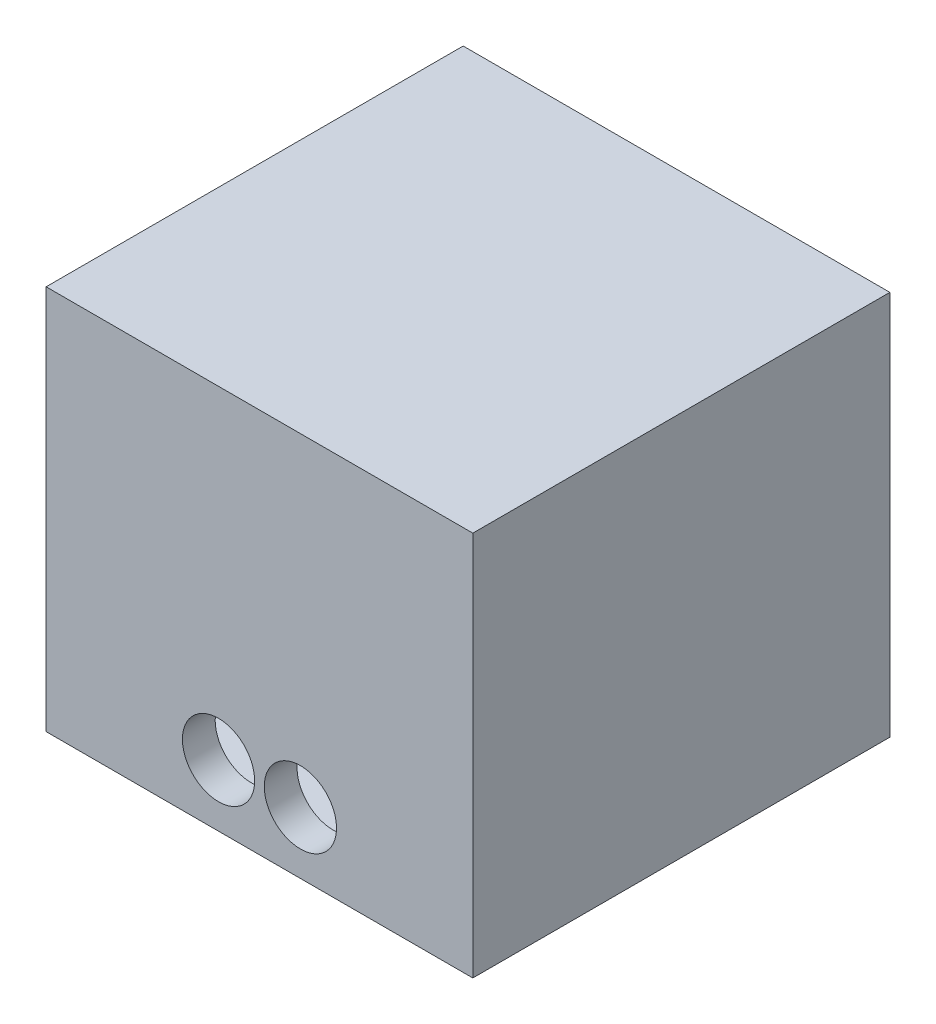
ISO-10303-21;
HEADER;
FILE_DESCRIPTION(('STEP AP214'),'2;1');
FILE_NAME('part.step','',(''),(''),'','','');
FILE_SCHEMA(('AUTOMOTIVE_DESIGN { 1 0 10303 214 1 1 1 1 }'));
ENDSEC;
DATA;
#1=APPLICATION_CONTEXT('core data for automotive mechanical design processes');
#2=APPLICATION_PROTOCOL_DEFINITION('international standard','automotive_design',2000,#1);
#3=PRODUCT_CONTEXT('',#1,'mechanical');
#4=PRODUCT('Part','Part','',(#3));
#5=PRODUCT_RELATED_PRODUCT_CATEGORY('part','',(#4));
#6=PRODUCT_DEFINITION_FORMATION('','',#4);
#7=PRODUCT_DEFINITION_CONTEXT('part definition',#1,'design');
#8=PRODUCT_DEFINITION('design','',#6,#7);
#9=PRODUCT_DEFINITION_SHAPE('','',#8);
#10=(LENGTH_UNIT() NAMED_UNIT(*) SI_UNIT(.MILLI.,.METRE.));
#11=(NAMED_UNIT(*) PLANE_ANGLE_UNIT() SI_UNIT($,.RADIAN.));
#12=(NAMED_UNIT(*) SI_UNIT($,.STERADIAN.) SOLID_ANGLE_UNIT());
#13=UNCERTAINTY_MEASURE_WITH_UNIT(LENGTH_MEASURE(1.E-05),#10,'distance_accuracy_value','');
#14=(GEOMETRIC_REPRESENTATION_CONTEXT(3) GLOBAL_UNCERTAINTY_ASSIGNED_CONTEXT((#13)) GLOBAL_UNIT_ASSIGNED_CONTEXT((#10,
#11,#12)) REPRESENTATION_CONTEXT('',''));
#15=CARTESIAN_POINT('',(0.,0.,0.));
#16=DIRECTION('',(0.,0.,1.));
#17=DIRECTION('',(1.,0.,0.));
#18=AXIS2_PLACEMENT_3D('',#15,#16,#17);
#19=CARTESIAN_POINT('',(0.,0.,433.));
#20=DIRECTION('',(0.,0.,1.));
#21=DIRECTION('',(1.,0.,0.));
#22=AXIS2_PLACEMENT_3D('',#19,#20,#21);
#23=PLANE('',#22);
#24=DIRECTION('',(-1.,0.,0.));
#25=VECTOR('',#24,1.);
#26=CARTESIAN_POINT('',(443.,782.,433.));
#27=LINE('',#26,#25);
#28=CARTESIAN_POINT('',(443.,782.,433.));
#29=VERTEX_POINT('',#28);
#30=CARTESIAN_POINT('',(-443.,782.,433.));
#31=VERTEX_POINT('',#30);
#32=EDGE_CURVE('E252',#29,#31,#27,.T.);
#33=ORIENTED_EDGE('',*,*,#32,.T.);
#34=DIRECTION('',(0.,-1.,0.));
#35=VECTOR('',#34,1.);
#36=CARTESIAN_POINT('',(-443.,782.,433.));
#37=LINE('',#36,#35);
#38=CARTESIAN_POINT('',(-443.,-18.,433.));
#39=VERTEX_POINT('',#38);
#40=EDGE_CURVE('E271',#31,#39,#37,.T.);
#41=ORIENTED_EDGE('',*,*,#40,.T.);
#42=DIRECTION('',(1.,0.,0.));
#43=VECTOR('',#42,1.);
#44=CARTESIAN_POINT('',(-443.,-18.,433.));
#45=LINE('',#44,#43);
#46=CARTESIAN_POINT('',(443.,-18.,433.));
#47=VERTEX_POINT('',#46);
#48=EDGE_CURVE('E276',#39,#47,#45,.T.);
#49=ORIENTED_EDGE('',*,*,#48,.T.);
#50=DIRECTION('',(0.,1.,0.));
#51=VECTOR('',#50,1.);
#52=CARTESIAN_POINT('',(443.,-18.,433.));
#53=LINE('',#52,#51);
#54=EDGE_CURVE('E262',#47,#29,#53,.T.);
#55=ORIENTED_EDGE('',*,*,#54,.T.);
#56=EDGE_LOOP('',(#33,#41,#49,#55));
#57=FACE_BOUND('',#56,.T.);
#58=CARTESIAN_POINT('',(-85.,110.,433.));
#59=DIRECTION('',(0.,0.,-1.));
#60=DIRECTION('',(-1.,0.,0.));
#61=AXIS2_PLACEMENT_3D('',#58,#59,#60);
#62=CIRCLE('',#61,75.);
#63=CARTESIAN_POINT('',(-160.,110.,433.));
#64=VERTEX_POINT('',#63);
#65=EDGE_CURVE('E431',#64,#64,#62,.T.);
#66=ORIENTED_EDGE('',*,*,#65,.T.);
#67=EDGE_LOOP('',(#66));
#68=FACE_BOUND('',#67,.T.);
#69=CARTESIAN_POINT('',(85.,110.,433.));
#70=DIRECTION('',(0.,0.,-1.));
#71=DIRECTION('',(-1.,0.,0.));
#72=AXIS2_PLACEMENT_3D('',#69,#70,#71);
#73=CIRCLE('',#72,75.);
#74=CARTESIAN_POINT('',(9.99999999999998,110.,433.));
#75=VERTEX_POINT('',#74);
#76=EDGE_CURVE('E423',#75,#75,#73,.T.);
#77=ORIENTED_EDGE('',*,*,#76,.T.);
#78=EDGE_LOOP('',(#77));
#79=FACE_BOUND('',#78,.T.);
#80=ADVANCED_FACE('F37',(#57,#68,#79),#23,.T.);
#81=CARTESIAN_POINT('',(425.,757.,-415.));
#82=DIRECTION('',(0.,0.,-1.));
#83=DIRECTION('',(0.,1.,0.));
#84=AXIS2_PLACEMENT_3D('',#81,#82,#83);
#85=PLANE('',#84);
#86=DIRECTION('',(1.,0.,0.));
#87=VECTOR('',#86,1.);
#88=CARTESIAN_POINT('',(425.,740.,-415.));
#89=LINE('',#88,#87);
#90=CARTESIAN_POINT('',(-285.,740.,-415.));
#91=VERTEX_POINT('',#90);
#92=CARTESIAN_POINT('',(285.,740.,-415.));
#93=VERTEX_POINT('',#92);
#94=EDGE_CURVE('E48',#91,#93,#89,.T.);
#95=ORIENTED_EDGE('',*,*,#94,.T.);
#96=CARTESIAN_POINT('',(285.,725.,-415.));
#97=DIRECTION('',(0.,0.,-1.));
#98=DIRECTION('',(0.,1.,0.));
#99=AXIS2_PLACEMENT_3D('',#96,#97,#98);
#100=CIRCLE('',#99,15.);
#101=CARTESIAN_POINT('',(300.,725.,-415.));
#102=VERTEX_POINT('',#101);
#103=EDGE_CURVE('E11',#93,#102,#100,.T.);
#104=ORIENTED_EDGE('',*,*,#103,.T.);
#105=DIRECTION('',(0.,-1.,0.));
#106=VECTOR('',#105,1.);
#107=CARTESIAN_POINT('',(300.,757.000000000001,-415.));
#108=LINE('',#107,#106);
#109=CARTESIAN_POINT('',(300.,715.,-415.));
#110=VERTEX_POINT('',#109);
#111=EDGE_CURVE('E281',#102,#110,#108,.T.);
#112=ORIENTED_EDGE('',*,*,#111,.T.);
#113=CARTESIAN_POINT('',(285.,715.,-415.));
#114=DIRECTION('',(0.,0.,-1.));
#115=DIRECTION('',(0.,1.,0.));
#116=AXIS2_PLACEMENT_3D('',#113,#114,#115);
#117=CIRCLE('',#116,14.9999999999997);
#118=CARTESIAN_POINT('',(285.,700.,-415.));
#119=VERTEX_POINT('',#118);
#120=EDGE_CURVE('E293',#110,#119,#117,.T.);
#121=ORIENTED_EDGE('',*,*,#120,.T.);
#122=DIRECTION('',(-1.,0.,0.));
#123=VECTOR('',#122,1.);
#124=CARTESIAN_POINT('',(425.,700.,-415.));
#125=LINE('',#124,#123);
#126=CARTESIAN_POINT('',(-285.,700.,-415.));
#127=VERTEX_POINT('',#126);
#128=EDGE_CURVE('E295',#119,#127,#125,.T.);
#129=ORIENTED_EDGE('',*,*,#128,.T.);
#130=CARTESIAN_POINT('',(-285.,715.,-415.));
#131=DIRECTION('',(0.,0.,-1.));
#132=DIRECTION('',(0.,1.,0.));
#133=AXIS2_PLACEMENT_3D('',#130,#131,#132);
#134=CIRCLE('',#133,14.9999999999997);
#135=CARTESIAN_POINT('',(-300.,715.,-415.));
#136=VERTEX_POINT('',#135);
#137=EDGE_CURVE('E300',#127,#136,#134,.T.);
#138=ORIENTED_EDGE('',*,*,#137,.T.);
#139=DIRECTION('',(0.,1.,0.));
#140=VECTOR('',#139,1.);
#141=CARTESIAN_POINT('',(-300.,757.,-415.));
#142=LINE('',#141,#140);
#143=CARTESIAN_POINT('',(-300.,725.,-415.));
#144=VERTEX_POINT('',#143);
#145=EDGE_CURVE('E297',#136,#144,#142,.T.);
#146=ORIENTED_EDGE('',*,*,#145,.T.);
#147=CARTESIAN_POINT('',(-285.,725.,-415.));
#148=DIRECTION('',(0.,0.,-1.));
#149=DIRECTION('',(0.,1.,0.));
#150=AXIS2_PLACEMENT_3D('',#147,#148,#149);
#151=CIRCLE('',#150,15.0000000000001);
#152=EDGE_CURVE('E303',#144,#91,#151,.T.);
#153=ORIENTED_EDGE('',*,*,#152,.T.);
#154=EDGE_LOOP('',(#95,#104,#112,#121,#129,#138,#146,#153));
#155=FACE_BOUND('',#154,.T.);
#156=DIRECTION('',(0.,-1.,0.));
#157=VECTOR('',#156,1.);
#158=CARTESIAN_POINT('',(-425.,757.,-415.));
#159=LINE('',#158,#157);
#160=CARTESIAN_POINT('',(-425.,757.,-415.));
#161=VERTEX_POINT('',#160);
#162=CARTESIAN_POINT('',(-425.,6.9999999999999,-415.));
#163=VERTEX_POINT('',#162);
#164=EDGE_CURVE('E211',#161,#163,#159,.T.);
#165=ORIENTED_EDGE('',*,*,#164,.T.);
#166=DIRECTION('',(-1.,0.,0.));
#167=VECTOR('',#166,1.);
#168=CARTESIAN_POINT('',(425.,6.9999999999999,-415.));
#169=LINE('',#168,#167);
#170=CARTESIAN_POINT('',(425.,6.9999999999999,-415.));
#171=VERTEX_POINT('',#170);
#172=EDGE_CURVE('E238',#171,#163,#169,.T.);
#173=ORIENTED_EDGE('',*,*,#172,.F.);
#174=DIRECTION('',(0.,-1.,0.));
#175=VECTOR('',#174,1.);
#176=CARTESIAN_POINT('',(425.,757.,-415.));
#177=LINE('',#176,#175);
#178=CARTESIAN_POINT('',(425.,757.,-415.));
#179=VERTEX_POINT('',#178);
#180=EDGE_CURVE('E221',#179,#171,#177,.T.);
#181=ORIENTED_EDGE('',*,*,#180,.F.);
#182=DIRECTION('',(-1.,0.,0.));
#183=VECTOR('',#182,1.);
#184=CARTESIAN_POINT('',(425.,757.,-415.));
#185=LINE('',#184,#183);
#186=EDGE_CURVE('E248',#179,#161,#185,.T.);
#187=ORIENTED_EDGE('',*,*,#186,.T.);
#188=EDGE_LOOP('',(#165,#173,#181,#187));
#189=FACE_BOUND('',#188,.T.);
#190=ADVANCED_FACE('F310',(#155,#189),#85,.F.);
#191=CARTESIAN_POINT('',(425.,757.,415.));
#192=DIRECTION('',(0.,1.,0.));
#193=DIRECTION('',(0.,0.,1.));
#194=AXIS2_PLACEMENT_3D('',#191,#192,#193);
#195=PLANE('',#194);
#196=DIRECTION('',(0.,0.,-1.));
#197=VECTOR('',#196,1.);
#198=CARTESIAN_POINT('',(-425.,757.,415.));
#199=LINE('',#198,#197);
#200=CARTESIAN_POINT('',(-425.,757.,415.));
#201=VERTEX_POINT('',#200);
#202=EDGE_CURVE('E230',#201,#161,#199,.T.);
#203=ORIENTED_EDGE('',*,*,#202,.T.);
#204=ORIENTED_EDGE('',*,*,#186,.F.);
#205=DIRECTION('',(0.,0.,-1.));
#206=VECTOR('',#205,1.);
#207=CARTESIAN_POINT('',(425.,757.,415.));
#208=LINE('',#207,#206);
#209=CARTESIAN_POINT('',(425.,757.,415.));
#210=VERTEX_POINT('',#209);
#211=EDGE_CURVE('E232',#210,#179,#208,.T.);
#212=ORIENTED_EDGE('',*,*,#211,.F.);
#213=DIRECTION('',(-1.,0.,0.));
#214=VECTOR('',#213,1.);
#215=CARTESIAN_POINT('',(425.,757.,415.));
#216=LINE('',#215,#214);
#217=EDGE_CURVE('E255',#210,#201,#216,.T.);
#218=ORIENTED_EDGE('',*,*,#217,.T.);
#219=EDGE_LOOP('',(#203,#204,#212,#218));
#220=FACE_BOUND('',#219,.T.);
#221=ADVANCED_FACE('F352',(#220),#195,.F.);
#222=CARTESIAN_POINT('',(425.,6.9999999999999,415.));
#223=DIRECTION('',(0.,0.,1.));
#224=DIRECTION('',(0.,-1.,0.));
#225=AXIS2_PLACEMENT_3D('',#222,#223,#224);
#226=PLANE('',#225);
#227=CARTESIAN_POINT('',(-85.,110.,415.));
#228=DIRECTION('',(0.,0.,-1.));
#229=DIRECTION('',(1.,0.,0.));
#230=AXIS2_PLACEMENT_3D('',#227,#228,#229);
#231=CIRCLE('',#230,90.);
#232=CARTESIAN_POINT('',(0.,80.419601084502,415.));
#233=VERTEX_POINT('',#232);
#234=CARTESIAN_POINT('',(0.,139.580398915498,415.));
#235=VERTEX_POINT('',#234);
#236=EDGE_CURVE('E181',#233,#235,#231,.T.);
#237=ORIENTED_EDGE('',*,*,#236,.F.);
#238=CARTESIAN_POINT('',(85.,110.,415.));
#239=DIRECTION('',(0.,0.,-1.));
#240=DIRECTION('',(1.,0.,0.));
#241=AXIS2_PLACEMENT_3D('',#238,#239,#240);
#242=CIRCLE('',#241,90.);
#243=EDGE_CURVE('E53',#235,#233,#242,.T.);
#244=ORIENTED_EDGE('',*,*,#243,.F.);
#245=EDGE_LOOP('',(#237,#244));
#246=FACE_BOUND('',#245,.T.);
#247=DIRECTION('',(0.,1.,0.));
#248=VECTOR('',#247,1.);
#249=CARTESIAN_POINT('',(-425.,6.9999999999999,415.));
#250=LINE('',#249,#248);
#251=CARTESIAN_POINT('',(-425.,6.9999999999999,415.));
#252=VERTEX_POINT('',#251);
#253=EDGE_CURVE('E242',#252,#201,#250,.T.);
#254=ORIENTED_EDGE('',*,*,#253,.T.);
#255=ORIENTED_EDGE('',*,*,#217,.F.);
#256=DIRECTION('',(0.,1.,0.));
#257=VECTOR('',#256,1.);
#258=CARTESIAN_POINT('',(425.,6.9999999999999,415.));
#259=LINE('',#258,#257);
#260=CARTESIAN_POINT('',(425.,6.9999999999999,415.));
#261=VERTEX_POINT('',#260);
#262=EDGE_CURVE('E235',#261,#210,#259,.T.);
#263=ORIENTED_EDGE('',*,*,#262,.F.);
#264=DIRECTION('',(-1.,0.,0.));
#265=VECTOR('',#264,1.);
#266=CARTESIAN_POINT('',(425.,6.9999999999999,415.));
#267=LINE('',#266,#265);
#268=EDGE_CURVE('E251',#261,#252,#267,.T.);
#269=ORIENTED_EDGE('',*,*,#268,.T.);
#270=EDGE_LOOP('',(#254,#255,#263,#269));
#271=FACE_BOUND('',#270,.T.);
#272=ADVANCED_FACE('F512',(#246,#271),#226,.F.);
#273=CARTESIAN_POINT('',(425.,6.9999999999999,-415.));
#274=DIRECTION('',(0.,-1.,0.));
#275=DIRECTION('',(0.,0.,-1.));
#276=AXIS2_PLACEMENT_3D('',#273,#274,#275);
#277=PLANE('',#276);
#278=DIRECTION('',(0.,0.,1.));
#279=VECTOR('',#278,1.);
#280=CARTESIAN_POINT('',(-425.,6.9999999999999,-415.));
#281=LINE('',#280,#279);
#282=EDGE_CURVE('E241',#163,#252,#281,.T.);
#283=ORIENTED_EDGE('',*,*,#282,.T.);
#284=ORIENTED_EDGE('',*,*,#268,.F.);
#285=DIRECTION('',(0.,0.,1.));
#286=VECTOR('',#285,1.);
#287=CARTESIAN_POINT('',(425.,6.9999999999999,-415.));
#288=LINE('',#287,#286);
#289=EDGE_CURVE('E226',#171,#261,#288,.T.);
#290=ORIENTED_EDGE('',*,*,#289,.F.);
#291=ORIENTED_EDGE('',*,*,#172,.T.);
#292=EDGE_LOOP('',(#283,#284,#290,#291));
#293=FACE_BOUND('',#292,.T.);
#294=ADVANCED_FACE('F511',(#293),#277,.F.);
#295=CARTESIAN_POINT('',(425.,0.,0.));
#296=DIRECTION('',(-1.,0.,0.));
#297=DIRECTION('',(0.,0.,1.));
#298=AXIS2_PLACEMENT_3D('',#295,#296,#297);
#299=PLANE('',#298);
#300=ORIENTED_EDGE('',*,*,#180,.T.);
#301=ORIENTED_EDGE('',*,*,#289,.T.);
#302=ORIENTED_EDGE('',*,*,#262,.T.);
#303=ORIENTED_EDGE('',*,*,#211,.T.);
#304=EDGE_LOOP('',(#300,#301,#302,#303));
#305=FACE_BOUND('',#304,.T.);
#306=ADVANCED_FACE('F336',(#305),#299,.T.);
#307=CARTESIAN_POINT('',(-425.,0.,0.));
#308=DIRECTION('',(-1.,0.,0.));
#309=DIRECTION('',(0.,0.,1.));
#310=AXIS2_PLACEMENT_3D('',#307,#308,#309);
#311=PLANE('',#310);
#312=ORIENTED_EDGE('',*,*,#164,.F.);
#313=ORIENTED_EDGE('',*,*,#202,.F.);
#314=ORIENTED_EDGE('',*,*,#253,.F.);
#315=ORIENTED_EDGE('',*,*,#282,.F.);
#316=EDGE_LOOP('',(#312,#313,#314,#315));
#317=FACE_BOUND('',#316,.T.);
#318=ADVANCED_FACE('F326',(#317),#311,.F.);
#319=CARTESIAN_POINT('',(285.,725.,-145.));
#320=DIRECTION('',(0.,0.,-1.));
#321=DIRECTION('',(-1.,0.,0.));
#322=AXIS2_PLACEMENT_3D('',#319,#320,#321);
#323=CYLINDRICAL_SURFACE('',#322,15.);
#324=DIRECTION('',(0.,0.,-1.));
#325=VECTOR('',#324,1.);
#326=CARTESIAN_POINT('',(285.,740.,-145.));
#327=LINE('',#326,#325);
#328=CARTESIAN_POINT('',(285.,740.,-433.));
#329=VERTEX_POINT('',#328);
#330=EDGE_CURVE('E209',#93,#329,#327,.T.);
#331=ORIENTED_EDGE('',*,*,#330,.T.);
#332=CARTESIAN_POINT('',(285.,725.,-433.));
#333=DIRECTION('',(0.,0.,-1.));
#334=DIRECTION('',(-1.,0.,0.));
#335=AXIS2_PLACEMENT_3D('',#332,#333,#334);
#336=CIRCLE('',#335,15.);
#337=CARTESIAN_POINT('',(300.,725.,-433.));
#338=VERTEX_POINT('',#337);
#339=EDGE_CURVE('E62',#329,#338,#336,.T.);
#340=ORIENTED_EDGE('',*,*,#339,.T.);
#341=DIRECTION('',(0.,0.,-1.));
#342=VECTOR('',#341,1.);
#343=CARTESIAN_POINT('',(300.,725.,-145.));
#344=LINE('',#343,#342);
#345=EDGE_CURVE('E206',#102,#338,#344,.T.);
#346=ORIENTED_EDGE('',*,*,#345,.F.);
#347=ORIENTED_EDGE('',*,*,#103,.F.);
#348=EDGE_LOOP('',(#331,#340,#346,#347));
#349=FACE_BOUND('',#348,.T.);
#350=ADVANCED_FACE('F329',(#349),#323,.F.);
#351=CARTESIAN_POINT('',(-285.,740.,-145.));
#352=DIRECTION('',(0.,1.,0.));
#353=DIRECTION('',(-1.,0.,0.));
#354=AXIS2_PLACEMENT_3D('',#351,#352,#353);
#355=PLANE('',#354);
#356=DIRECTION('',(0.,0.,-1.));
#357=VECTOR('',#356,1.);
#358=CARTESIAN_POINT('',(-285.,740.,-145.));
#359=LINE('',#358,#357);
#360=CARTESIAN_POINT('',(-285.,740.,-433.));
#361=VERTEX_POINT('',#360);
#362=EDGE_CURVE('E212',#91,#361,#359,.T.);
#363=ORIENTED_EDGE('',*,*,#362,.T.);
#364=DIRECTION('',(1.,0.,0.));
#365=VECTOR('',#364,1.);
#366=CARTESIAN_POINT('',(-285.,740.,-433.));
#367=LINE('',#366,#365);
#368=EDGE_CURVE('E204',#361,#329,#367,.T.);
#369=ORIENTED_EDGE('',*,*,#368,.T.);
#370=ORIENTED_EDGE('',*,*,#330,.F.);
#371=ORIENTED_EDGE('',*,*,#94,.F.);
#372=EDGE_LOOP('',(#363,#369,#370,#371));
#373=FACE_BOUND('',#372,.T.);
#374=ADVANCED_FACE('F315',(#373),#355,.F.);
#375=CARTESIAN_POINT('',(-285.,725.,-145.));
#376=DIRECTION('',(0.,0.,-1.));
#377=DIRECTION('',(-1.,0.,0.));
#378=AXIS2_PLACEMENT_3D('',#375,#376,#377);
#379=CYLINDRICAL_SURFACE('',#378,15.0000000000001);
#380=DIRECTION('',(0.,0.,-1.));
#381=VECTOR('',#380,1.);
#382=CARTESIAN_POINT('',(-300.,725.,-145.));
#383=LINE('',#382,#381);
#384=CARTESIAN_POINT('',(-300.,725.,-433.));
#385=VERTEX_POINT('',#384);
#386=EDGE_CURVE('E213',#144,#385,#383,.T.);
#387=ORIENTED_EDGE('',*,*,#386,.T.);
#388=CARTESIAN_POINT('',(-285.,725.,-433.));
#389=DIRECTION('',(0.,0.,-1.));
#390=DIRECTION('',(-1.,0.,0.));
#391=AXIS2_PLACEMENT_3D('',#388,#389,#390);
#392=CIRCLE('',#391,15.0000000000001);
#393=EDGE_CURVE('E205',#385,#361,#392,.T.);
#394=ORIENTED_EDGE('',*,*,#393,.T.);
#395=ORIENTED_EDGE('',*,*,#362,.F.);
#396=ORIENTED_EDGE('',*,*,#152,.F.);
#397=EDGE_LOOP('',(#387,#394,#395,#396));
#398=FACE_BOUND('',#397,.T.);
#399=ADVANCED_FACE('F313',(#398),#379,.F.);
#400=CARTESIAN_POINT('',(-300.,715.,-145.));
#401=DIRECTION('',(-1.,0.,0.));
#402=DIRECTION('',(0.,0.,1.));
#403=AXIS2_PLACEMENT_3D('',#400,#401,#402);
#404=PLANE('',#403);
#405=DIRECTION('',(0.,0.,-1.));
#406=VECTOR('',#405,1.);
#407=CARTESIAN_POINT('',(-300.,715.,-145.));
#408=LINE('',#407,#406);
#409=CARTESIAN_POINT('',(-300.,715.,-433.));
#410=VERTEX_POINT('',#409);
#411=EDGE_CURVE('E218',#136,#410,#408,.T.);
#412=ORIENTED_EDGE('',*,*,#411,.T.);
#413=DIRECTION('',(0.,1.,0.));
#414=VECTOR('',#413,1.);
#415=CARTESIAN_POINT('',(-300.,715.,-433.));
#416=LINE('',#415,#414);
#417=EDGE_CURVE('E196',#410,#385,#416,.T.);
#418=ORIENTED_EDGE('',*,*,#417,.T.);
#419=ORIENTED_EDGE('',*,*,#386,.F.);
#420=ORIENTED_EDGE('',*,*,#145,.F.);
#421=EDGE_LOOP('',(#412,#418,#419,#420));
#422=FACE_BOUND('',#421,.T.);
#423=ADVANCED_FACE('F399',(#422),#404,.F.);
#424=CARTESIAN_POINT('',(-285.,715.,-145.));
#425=DIRECTION('',(0.,0.,-1.));
#426=DIRECTION('',(-1.,0.,0.));
#427=AXIS2_PLACEMENT_3D('',#424,#425,#426);
#428=CYLINDRICAL_SURFACE('',#427,14.9999999999997);
#429=DIRECTION('',(0.,0.,-1.));
#430=VECTOR('',#429,1.);
#431=CARTESIAN_POINT('',(-285.,700.,-145.));
#432=LINE('',#431,#430);
#433=CARTESIAN_POINT('',(-285.,700.,-433.));
#434=VERTEX_POINT('',#433);
#435=EDGE_CURVE('E216',#127,#434,#432,.T.);
#436=ORIENTED_EDGE('',*,*,#435,.T.);
#437=CARTESIAN_POINT('',(-285.,715.,-433.));
#438=DIRECTION('',(0.,0.,-1.));
#439=DIRECTION('',(-1.,0.,0.));
#440=AXIS2_PLACEMENT_3D('',#437,#438,#439);
#441=CIRCLE('',#440,14.9999999999997);
#442=EDGE_CURVE('E197',#434,#410,#441,.T.);
#443=ORIENTED_EDGE('',*,*,#442,.T.);
#444=ORIENTED_EDGE('',*,*,#411,.F.);
#445=ORIENTED_EDGE('',*,*,#137,.F.);
#446=EDGE_LOOP('',(#436,#443,#444,#445));
#447=FACE_BOUND('',#446,.T.);
#448=ADVANCED_FACE('F396',(#447),#428,.F.);
#449=CARTESIAN_POINT('',(285.,700.,-145.));
#450=DIRECTION('',(0.,-1.,0.));
#451=DIRECTION('',(0.,0.,-1.));
#452=AXIS2_PLACEMENT_3D('',#449,#450,#451);
#453=PLANE('',#452);
#454=DIRECTION('',(0.,0.,-1.));
#455=VECTOR('',#454,1.);
#456=CARTESIAN_POINT('',(285.,700.,-145.));
#457=LINE('',#456,#455);
#458=CARTESIAN_POINT('',(285.,700.,-433.));
#459=VERTEX_POINT('',#458);
#460=EDGE_CURVE('E217',#119,#459,#457,.T.);
#461=ORIENTED_EDGE('',*,*,#460,.T.);
#462=DIRECTION('',(-1.,0.,0.));
#463=VECTOR('',#462,1.);
#464=CARTESIAN_POINT('',(285.,700.,-433.));
#465=LINE('',#464,#463);
#466=EDGE_CURVE('E194',#459,#434,#465,.T.);
#467=ORIENTED_EDGE('',*,*,#466,.T.);
#468=ORIENTED_EDGE('',*,*,#435,.F.);
#469=ORIENTED_EDGE('',*,*,#128,.F.);
#470=EDGE_LOOP('',(#461,#467,#468,#469));
#471=FACE_BOUND('',#470,.T.);
#472=ADVANCED_FACE('F390',(#471),#453,.F.);
#473=CARTESIAN_POINT('',(285.,715.,-145.));
#474=DIRECTION('',(0.,0.,-1.));
#475=DIRECTION('',(-1.,0.,0.));
#476=AXIS2_PLACEMENT_3D('',#473,#474,#475);
#477=CYLINDRICAL_SURFACE('',#476,14.9999999999997);
#478=DIRECTION('',(0.,0.,-1.));
#479=VECTOR('',#478,1.);
#480=CARTESIAN_POINT('',(300.,715.,-145.));
#481=LINE('',#480,#479);
#482=CARTESIAN_POINT('',(300.,715.,-433.));
#483=VERTEX_POINT('',#482);
#484=EDGE_CURVE('E225',#110,#483,#481,.T.);
#485=ORIENTED_EDGE('',*,*,#484,.T.);
#486=CARTESIAN_POINT('',(285.,715.,-433.));
#487=DIRECTION('',(0.,0.,-1.));
#488=DIRECTION('',(-1.,0.,0.));
#489=AXIS2_PLACEMENT_3D('',#486,#487,#488);
#490=CIRCLE('',#489,14.9999999999997);
#491=EDGE_CURVE('E188',#483,#459,#490,.T.);
#492=ORIENTED_EDGE('',*,*,#491,.T.);
#493=ORIENTED_EDGE('',*,*,#460,.F.);
#494=ORIENTED_EDGE('',*,*,#120,.F.);
#495=EDGE_LOOP('',(#485,#492,#493,#494));
#496=FACE_BOUND('',#495,.T.);
#497=ADVANCED_FACE('F387',(#496),#477,.F.);
#498=CARTESIAN_POINT('',(300.,725.,-145.));
#499=DIRECTION('',(1.,0.,0.));
#500=DIRECTION('',(0.,1.,0.));
#501=AXIS2_PLACEMENT_3D('',#498,#499,#500);
#502=PLANE('',#501);
#503=ORIENTED_EDGE('',*,*,#345,.T.);
#504=DIRECTION('',(0.,-1.,0.));
#505=VECTOR('',#504,1.);
#506=CARTESIAN_POINT('',(300.,725.,-433.));
#507=LINE('',#506,#505);
#508=EDGE_CURVE('E182',#338,#483,#507,.T.);
#509=ORIENTED_EDGE('',*,*,#508,.T.);
#510=ORIENTED_EDGE('',*,*,#484,.F.);
#511=ORIENTED_EDGE('',*,*,#111,.F.);
#512=EDGE_LOOP('',(#503,#509,#510,#511));
#513=FACE_BOUND('',#512,.T.);
#514=ADVANCED_FACE('F325',(#513),#502,.F.);
#515=CARTESIAN_POINT('',(0.,0.,-433.));
#516=DIRECTION('',(0.,0.,1.));
#517=DIRECTION('',(1.,0.,0.));
#518=AXIS2_PLACEMENT_3D('',#515,#516,#517);
#519=PLANE('',#518);
#520=DIRECTION('',(-1.,0.,0.));
#521=VECTOR('',#520,1.);
#522=CARTESIAN_POINT('',(443.,782.,-433.));
#523=LINE('',#522,#521);
#524=CARTESIAN_POINT('',(443.,782.,-433.));
#525=VERTEX_POINT('',#524);
#526=CARTESIAN_POINT('',(-443.,782.,-433.));
#527=VERTEX_POINT('',#526);
#528=EDGE_CURVE('E257',#525,#527,#523,.T.);
#529=ORIENTED_EDGE('',*,*,#528,.F.);
#530=DIRECTION('',(0.,1.,0.));
#531=VECTOR('',#530,1.);
#532=CARTESIAN_POINT('',(443.,-18.,-433.));
#533=LINE('',#532,#531);
#534=CARTESIAN_POINT('',(443.,-18.,-433.));
#535=VERTEX_POINT('',#534);
#536=EDGE_CURVE('E270',#535,#525,#533,.T.);
#537=ORIENTED_EDGE('',*,*,#536,.F.);
#538=DIRECTION('',(1.,0.,0.));
#539=VECTOR('',#538,1.);
#540=CARTESIAN_POINT('',(-443.,-18.,-433.));
#541=LINE('',#540,#539);
#542=CARTESIAN_POINT('',(-443.,-18.,-433.));
#543=VERTEX_POINT('',#542);
#544=EDGE_CURVE('E261',#543,#535,#541,.T.);
#545=ORIENTED_EDGE('',*,*,#544,.F.);
#546=DIRECTION('',(0.,-1.,0.));
#547=VECTOR('',#546,1.);
#548=CARTESIAN_POINT('',(-443.,782.,-433.));
#549=LINE('',#548,#547);
#550=EDGE_CURVE('E260',#527,#543,#549,.T.);
#551=ORIENTED_EDGE('',*,*,#550,.F.);
#552=EDGE_LOOP('',(#529,#537,#545,#551));
#553=FACE_BOUND('',#552,.T.);
#554=ORIENTED_EDGE('',*,*,#339,.F.);
#555=ORIENTED_EDGE('',*,*,#368,.F.);
#556=ORIENTED_EDGE('',*,*,#393,.F.);
#557=ORIENTED_EDGE('',*,*,#417,.F.);
#558=ORIENTED_EDGE('',*,*,#442,.F.);
#559=ORIENTED_EDGE('',*,*,#466,.F.);
#560=ORIENTED_EDGE('',*,*,#491,.F.);
#561=ORIENTED_EDGE('',*,*,#508,.F.);
#562=EDGE_LOOP('',(#554,#555,#556,#557,#558,#559,#560,#561));
#563=FACE_BOUND('',#562,.T.);
#564=ADVANCED_FACE('F318',(#553,#563),#519,.F.);
#565=CARTESIAN_POINT('',(443.,782.,-433.));
#566=DIRECTION('',(0.,1.,0.));
#567=DIRECTION('',(0.,0.,1.));
#568=AXIS2_PLACEMENT_3D('',#565,#566,#567);
#569=PLANE('',#568);
#570=ORIENTED_EDGE('',*,*,#32,.F.);
#571=DIRECTION('',(0.,0.,1.));
#572=VECTOR('',#571,1.);
#573=CARTESIAN_POINT('',(443.,782.,-433.));
#574=LINE('',#573,#572);
#575=EDGE_CURVE('E283',#525,#29,#574,.T.);
#576=ORIENTED_EDGE('',*,*,#575,.F.);
#577=ORIENTED_EDGE('',*,*,#528,.T.);
#578=DIRECTION('',(0.,0.,1.));
#579=VECTOR('',#578,1.);
#580=CARTESIAN_POINT('',(-443.,782.,-433.));
#581=LINE('',#580,#579);
#582=EDGE_CURVE('E269',#527,#31,#581,.T.);
#583=ORIENTED_EDGE('',*,*,#582,.T.);
#584=EDGE_LOOP('',(#570,#576,#577,#583));
#585=FACE_BOUND('',#584,.T.);
#586=ADVANCED_FACE('F45',(#585),#569,.T.);
#587=CARTESIAN_POINT('',(443.,-18.,-433.));
#588=DIRECTION('',(1.,0.,0.));
#589=DIRECTION('',(0.,0.,-1.));
#590=AXIS2_PLACEMENT_3D('',#587,#588,#589);
#591=PLANE('',#590);
#592=ORIENTED_EDGE('',*,*,#54,.F.);
#593=DIRECTION('',(0.,0.,1.));
#594=VECTOR('',#593,1.);
#595=CARTESIAN_POINT('',(443.,-18.,-433.));
#596=LINE('',#595,#594);
#597=EDGE_CURVE('E284',#535,#47,#596,.T.);
#598=ORIENTED_EDGE('',*,*,#597,.F.);
#599=ORIENTED_EDGE('',*,*,#536,.T.);
#600=ORIENTED_EDGE('',*,*,#575,.T.);
#601=EDGE_LOOP('',(#592,#598,#599,#600));
#602=FACE_BOUND('',#601,.T.);
#603=ADVANCED_FACE('F358',(#602),#591,.T.);
#604=CARTESIAN_POINT('',(-443.,-18.,-433.));
#605=DIRECTION('',(0.,-1.,0.));
#606=DIRECTION('',(0.,0.,-1.));
#607=AXIS2_PLACEMENT_3D('',#604,#605,#606);
#608=PLANE('',#607);
#609=ORIENTED_EDGE('',*,*,#48,.F.);
#610=DIRECTION('',(0.,0.,1.));
#611=VECTOR('',#610,1.);
#612=CARTESIAN_POINT('',(-443.,-18.,-433.));
#613=LINE('',#612,#611);
#614=EDGE_CURVE('E287',#543,#39,#613,.T.);
#615=ORIENTED_EDGE('',*,*,#614,.F.);
#616=ORIENTED_EDGE('',*,*,#544,.T.);
#617=ORIENTED_EDGE('',*,*,#597,.T.);
#618=EDGE_LOOP('',(#609,#615,#616,#617));
#619=FACE_BOUND('',#618,.T.);
#620=ADVANCED_FACE('F360',(#619),#608,.T.);
#621=CARTESIAN_POINT('',(-443.,782.,-433.));
#622=DIRECTION('',(-1.,0.,0.));
#623=DIRECTION('',(0.,-1.,0.));
#624=AXIS2_PLACEMENT_3D('',#621,#622,#623);
#625=PLANE('',#624);
#626=ORIENTED_EDGE('',*,*,#40,.F.);
#627=ORIENTED_EDGE('',*,*,#582,.F.);
#628=ORIENTED_EDGE('',*,*,#550,.T.);
#629=ORIENTED_EDGE('',*,*,#614,.T.);
#630=EDGE_LOOP('',(#626,#627,#628,#629));
#631=FACE_BOUND('',#630,.T.);
#632=ADVANCED_FACE('F365',(#631),#625,.T.);
#633=CARTESIAN_POINT('',(-85.,110.,365.));
#634=DIRECTION('',(0.,0.,1.));
#635=DIRECTION('',(1.,0.,0.));
#636=AXIS2_PLACEMENT_3D('',#633,#634,#635);
#637=CYLINDRICAL_SURFACE('',#636,90.);
#638=ORIENTED_EDGE('',*,*,#236,.T.);
#639=DIRECTION('',(0.,0.,1.));
#640=VECTOR('',#639,1.);
#641=CARTESIAN_POINT('',(0.,139.580398915498,365.));
#642=LINE('',#641,#640);
#643=CARTESIAN_POINT('',(0.,139.580398915498,365.));
#644=VERTEX_POINT('',#643);
#645=EDGE_CURVE('E169',#644,#235,#642,.T.);
#646=ORIENTED_EDGE('',*,*,#645,.F.);
#647=CARTESIAN_POINT('',(-85.,110.,365.));
#648=DIRECTION('',(0.,0.,-1.));
#649=DIRECTION('',(1.,0.,0.));
#650=AXIS2_PLACEMENT_3D('',#647,#648,#649);
#651=CIRCLE('',#650,90.);
#652=CARTESIAN_POINT('',(0.,80.419601084502,365.));
#653=VERTEX_POINT('',#652);
#654=EDGE_CURVE('E174',#653,#644,#651,.T.);
#655=ORIENTED_EDGE('',*,*,#654,.F.);
#656=DIRECTION('',(0.,0.,1.));
#657=VECTOR('',#656,1.);
#658=CARTESIAN_POINT('',(0.,80.419601084502,365.));
#659=LINE('',#658,#657);
#660=EDGE_CURVE('E175',#653,#233,#659,.T.);
#661=ORIENTED_EDGE('',*,*,#660,.T.);
#662=EDGE_LOOP('',(#638,#646,#655,#661));
#663=FACE_BOUND('',#662,.T.);
#664=ADVANCED_FACE('F179',(#663),#637,.T.);
#665=CARTESIAN_POINT('',(85.,110.,365.));
#666=DIRECTION('',(0.,0.,1.));
#667=DIRECTION('',(1.,0.,0.));
#668=AXIS2_PLACEMENT_3D('',#665,#666,#667);
#669=CYLINDRICAL_SURFACE('',#668,90.);
#670=ORIENTED_EDGE('',*,*,#243,.T.);
#671=ORIENTED_EDGE('',*,*,#660,.F.);
#672=CARTESIAN_POINT('',(85.,110.,365.));
#673=DIRECTION('',(0.,0.,-1.));
#674=DIRECTION('',(1.,0.,0.));
#675=AXIS2_PLACEMENT_3D('',#672,#673,#674);
#676=CIRCLE('',#675,90.);
#677=EDGE_CURVE('E164',#644,#653,#676,.T.);
#678=ORIENTED_EDGE('',*,*,#677,.F.);
#679=ORIENTED_EDGE('',*,*,#645,.T.);
#680=EDGE_LOOP('',(#670,#671,#678,#679));
#681=FACE_BOUND('',#680,.T.);
#682=ADVANCED_FACE('F170',(#681),#669,.T.);
#683=CARTESIAN_POINT('',(0.,110.,365.));
#684=DIRECTION('',(0.,0.,1.));
#685=DIRECTION('',(1.,0.,0.));
#686=AXIS2_PLACEMENT_3D('',#683,#684,#685);
#687=PLANE('',#686);
#688=CARTESIAN_POINT('',(85.,110.,365.));
#689=DIRECTION('',(0.,0.,-1.));
#690=DIRECTION('',(-1.,0.,0.));
#691=AXIS2_PLACEMENT_3D('',#688,#689,#690);
#692=CIRCLE('',#691,75.);
#693=CARTESIAN_POINT('',(9.99999999999998,110.,365.));
#694=VERTEX_POINT('',#693);
#695=EDGE_CURVE('E425',#694,#694,#692,.T.);
#696=ORIENTED_EDGE('',*,*,#695,.F.);
#697=EDGE_LOOP('',(#696));
#698=FACE_BOUND('',#697,.T.);
#699=CARTESIAN_POINT('',(-85.,110.,365.));
#700=DIRECTION('',(0.,0.,-1.));
#701=DIRECTION('',(-1.,0.,0.));
#702=AXIS2_PLACEMENT_3D('',#699,#700,#701);
#703=CIRCLE('',#702,75.);
#704=CARTESIAN_POINT('',(-160.,110.,365.));
#705=VERTEX_POINT('',#704);
#706=EDGE_CURVE('E428',#705,#705,#703,.T.);
#707=ORIENTED_EDGE('',*,*,#706,.F.);
#708=EDGE_LOOP('',(#707));
#709=FACE_BOUND('',#708,.T.);
#710=ORIENTED_EDGE('',*,*,#654,.T.);
#711=ORIENTED_EDGE('',*,*,#677,.T.);
#712=EDGE_LOOP('',(#710,#711));
#713=FACE_BOUND('',#712,.T.);
#714=ADVANCED_FACE('F180',(#698,#709,#713),#687,.F.);
#715=CARTESIAN_POINT('',(-85.,110.,365.));
#716=DIRECTION('',(0.,0.,-1.));
#717=DIRECTION('',(-1.,0.,0.));
#718=AXIS2_PLACEMENT_3D('',#715,#716,#717);
#719=CYLINDRICAL_SURFACE('',#718,75.);
#720=ORIENTED_EDGE('',*,*,#65,.F.);
#721=EDGE_LOOP('',(#720));
#722=FACE_BOUND('',#721,.T.);
#723=ORIENTED_EDGE('',*,*,#706,.T.);
#724=EDGE_LOOP('',(#723));
#725=FACE_BOUND('',#724,.T.);
#726=ADVANCED_FACE('F408',(#722,#725),#719,.F.);
#727=CARTESIAN_POINT('',(85.,110.,365.));
#728=DIRECTION('',(0.,0.,-1.));
#729=DIRECTION('',(-1.,0.,0.));
#730=AXIS2_PLACEMENT_3D('',#727,#728,#729);
#731=CYLINDRICAL_SURFACE('',#730,75.);
#732=ORIENTED_EDGE('',*,*,#76,.F.);
#733=EDGE_LOOP('',(#732));
#734=FACE_BOUND('',#733,.T.);
#735=ORIENTED_EDGE('',*,*,#695,.T.);
#736=EDGE_LOOP('',(#735));
#737=FACE_BOUND('',#736,.T.);
#738=ADVANCED_FACE('F411',(#734,#737),#731,.F.);
#739=CLOSED_SHELL('',(#80,#190,#221,#272,#294,#306,#318,#350,#374,#399,#423,#448,#472,#497,#514,
#564,#586,#603,#620,#632,#664,#682,#714,#726,#738));
#740=MANIFOLD_SOLID_BREP('B2',#739);
#741=ADVANCED_BREP_SHAPE_REPRESENTATION('',(#18,#740),#14);
#742=SHAPE_DEFINITION_REPRESENTATION(#9,#741);
ENDSEC;
END-ISO-10303-21;
